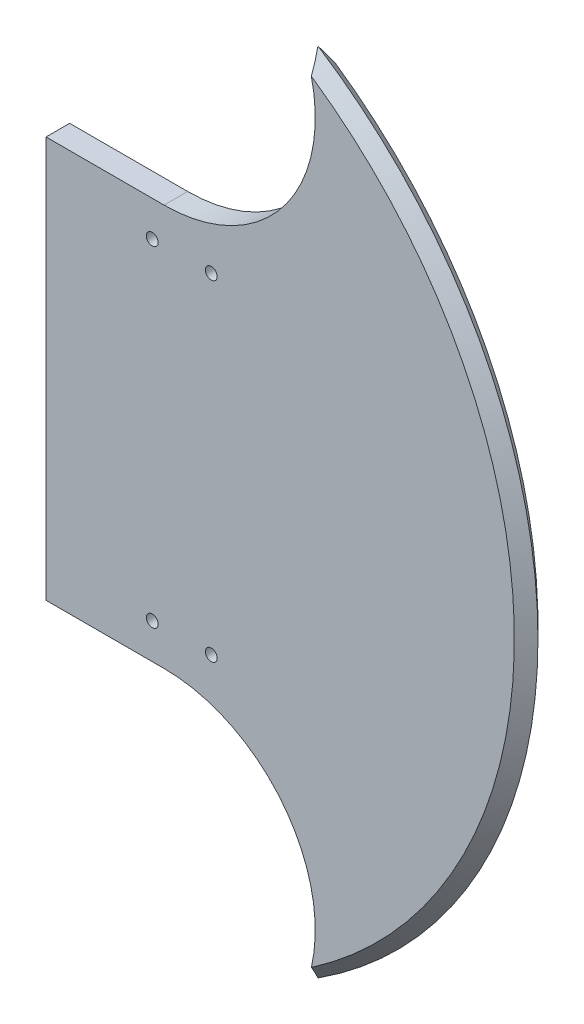
ISO-10303-21;
HEADER;
FILE_DESCRIPTION(('STEP AP214'),'2;1');
FILE_NAME('part.step','',(''),(''),'','','');
FILE_SCHEMA(('AUTOMOTIVE_DESIGN { 1 0 10303 214 1 1 1 1 }'));
ENDSEC;
DATA;
#1=APPLICATION_CONTEXT('core data for automotive mechanical design processes');
#2=APPLICATION_PROTOCOL_DEFINITION('international standard','automotive_design',2000,#1);
#3=PRODUCT_CONTEXT('',#1,'mechanical');
#4=PRODUCT('Part','Part','',(#3));
#5=PRODUCT_RELATED_PRODUCT_CATEGORY('part','',(#4));
#6=PRODUCT_DEFINITION_FORMATION('','',#4);
#7=PRODUCT_DEFINITION_CONTEXT('part definition',#1,'design');
#8=PRODUCT_DEFINITION('design','',#6,#7);
#9=PRODUCT_DEFINITION_SHAPE('','',#8);
#10=(LENGTH_UNIT() NAMED_UNIT(*) SI_UNIT(.MILLI.,.METRE.));
#11=(NAMED_UNIT(*) PLANE_ANGLE_UNIT() SI_UNIT($,.RADIAN.));
#12=(NAMED_UNIT(*) SI_UNIT($,.STERADIAN.) SOLID_ANGLE_UNIT());
#13=UNCERTAINTY_MEASURE_WITH_UNIT(LENGTH_MEASURE(1.E-05),#10,'distance_accuracy_value','');
#14=(GEOMETRIC_REPRESENTATION_CONTEXT(3) GLOBAL_UNCERTAINTY_ASSIGNED_CONTEXT((#13)) GLOBAL_UNIT_ASSIGNED_CONTEXT((#10,
#11,#12)) REPRESENTATION_CONTEXT('',''));
#15=CARTESIAN_POINT('',(0.,0.,0.));
#16=DIRECTION('',(0.,0.,1.));
#17=DIRECTION('',(1.,0.,0.));
#18=AXIS2_PLACEMENT_3D('',#15,#16,#17);
#19=CARTESIAN_POINT('',(0.,85.,10.));
#20=DIRECTION('',(0.,-1.,0.));
#21=DIRECTION('',(1.,0.,0.));
#22=AXIS2_PLACEMENT_3D('',#19,#20,#21);
#23=PLANE('',#22);
#24=DIRECTION('',(-1.,0.,0.));
#25=VECTOR('',#24,1.);
#26=CARTESIAN_POINT('',(0.,85.,0.));
#27=LINE('',#26,#25);
#28=CARTESIAN_POINT('',(50.,85.,0.));
#29=VERTEX_POINT('',#28);
#30=CARTESIAN_POINT('',(0.,85.,0.));
#31=VERTEX_POINT('',#30);
#32=EDGE_CURVE('E126',#29,#31,#27,.T.);
#33=ORIENTED_EDGE('',*,*,#32,.T.);
#34=DIRECTION('',(0.,0.,-1.));
#35=VECTOR('',#34,1.);
#36=CARTESIAN_POINT('',(0.,85.,10.));
#37=LINE('',#36,#35);
#38=CARTESIAN_POINT('',(0.,85.,10.));
#39=VERTEX_POINT('',#38);
#40=EDGE_CURVE('E105',#39,#31,#37,.T.);
#41=ORIENTED_EDGE('',*,*,#40,.F.);
#42=DIRECTION('',(-1.,0.,0.));
#43=VECTOR('',#42,1.);
#44=CARTESIAN_POINT('',(0.,85.,10.));
#45=LINE('',#44,#43);
#46=CARTESIAN_POINT('',(50.,85.,10.));
#47=VERTEX_POINT('',#46);
#48=EDGE_CURVE('E113',#47,#39,#45,.T.);
#49=ORIENTED_EDGE('',*,*,#48,.F.);
#50=DIRECTION('',(0.,0.,-1.));
#51=VECTOR('',#50,1.);
#52=CARTESIAN_POINT('',(50.,85.,10.));
#53=LINE('',#52,#51);
#54=EDGE_CURVE('E206',#47,#29,#53,.T.);
#55=ORIENTED_EDGE('',*,*,#54,.T.);
#56=EDGE_LOOP('',(#33,#41,#49,#55));
#57=FACE_BOUND('',#56,.T.);
#58=ADVANCED_FACE('F40',(#57),#23,.F.);
#59=CARTESIAN_POINT('',(0.,-85.,10.));
#60=DIRECTION('',(1.,0.,0.));
#61=DIRECTION('',(0.,0.,-1.));
#62=AXIS2_PLACEMENT_3D('',#59,#60,#61);
#63=PLANE('',#62);
#64=DIRECTION('',(0.,-1.,0.));
#65=VECTOR('',#64,1.);
#66=CARTESIAN_POINT('',(0.,-85.,0.));
#67=LINE('',#66,#65);
#68=CARTESIAN_POINT('',(0.,-85.,0.));
#69=VERTEX_POINT('',#68);
#70=EDGE_CURVE('E202',#31,#69,#67,.T.);
#71=ORIENTED_EDGE('',*,*,#70,.T.);
#72=DIRECTION('',(0.,0.,-1.));
#73=VECTOR('',#72,1.);
#74=CARTESIAN_POINT('',(0.,-85.,10.));
#75=LINE('',#74,#73);
#76=CARTESIAN_POINT('',(0.,-85.,10.));
#77=VERTEX_POINT('',#76);
#78=EDGE_CURVE('E108',#77,#69,#75,.T.);
#79=ORIENTED_EDGE('',*,*,#78,.F.);
#80=DIRECTION('',(0.,-1.,0.));
#81=VECTOR('',#80,1.);
#82=CARTESIAN_POINT('',(0.,-85.,10.));
#83=LINE('',#82,#81);
#84=EDGE_CURVE('E101',#39,#77,#83,.T.);
#85=ORIENTED_EDGE('',*,*,#84,.F.);
#86=ORIENTED_EDGE('',*,*,#40,.T.);
#87=EDGE_LOOP('',(#71,#79,#85,#86));
#88=FACE_BOUND('',#87,.T.);
#89=ADVANCED_FACE('F103',(#88),#63,.F.);
#90=CARTESIAN_POINT('',(0.,-85.,10.));
#91=DIRECTION('',(0.,1.,0.));
#92=DIRECTION('',(-1.,0.,0.));
#93=AXIS2_PLACEMENT_3D('',#90,#91,#92);
#94=PLANE('',#93);
#95=DIRECTION('',(1.,0.,0.));
#96=VECTOR('',#95,1.);
#97=CARTESIAN_POINT('',(0.,-85.,0.));
#98=LINE('',#97,#96);
#99=CARTESIAN_POINT('',(50.,-85.,0.));
#100=VERTEX_POINT('',#99);
#101=EDGE_CURVE('E196',#69,#100,#98,.T.);
#102=ORIENTED_EDGE('',*,*,#101,.T.);
#103=DIRECTION('',(0.,0.,-1.));
#104=VECTOR('',#103,1.);
#105=CARTESIAN_POINT('',(50.,-85.,10.));
#106=LINE('',#105,#104);
#107=CARTESIAN_POINT('',(50.,-85.,10.));
#108=VERTEX_POINT('',#107);
#109=EDGE_CURVE('E134',#108,#100,#106,.T.);
#110=ORIENTED_EDGE('',*,*,#109,.F.);
#111=DIRECTION('',(1.,0.,0.));
#112=VECTOR('',#111,1.);
#113=CARTESIAN_POINT('',(0.,-85.,10.));
#114=LINE('',#113,#112);
#115=EDGE_CURVE('E112',#77,#108,#114,.T.);
#116=ORIENTED_EDGE('',*,*,#115,.F.);
#117=ORIENTED_EDGE('',*,*,#78,.T.);
#118=EDGE_LOOP('',(#102,#110,#116,#117));
#119=FACE_BOUND('',#118,.T.);
#120=ADVANCED_FACE('F161',(#119),#94,.F.);
#121=CARTESIAN_POINT('',(50.,-149.050097962701,10.));
#122=DIRECTION('',(0.,0.,-1.));
#123=DIRECTION('',(-1.,0.,0.));
#124=AXIS2_PLACEMENT_3D('',#121,#122,#123);
#125=CYLINDRICAL_SURFACE('',#124,64.0500979627015);
#126=CARTESIAN_POINT('',(50.,-149.050097962701,0.));
#127=DIRECTION('',(0.,0.,-1.));
#128=DIRECTION('',(-1.,0.,0.));
#129=AXIS2_PLACEMENT_3D('',#126,#127,#128);
#130=CIRCLE('',#129,64.0500979627015);
#131=CARTESIAN_POINT('',(112.40494183221,-163.473630260655,0.));
#132=VERTEX_POINT('',#131);
#133=EDGE_CURVE('E201',#100,#132,#130,.T.);
#134=ORIENTED_EDGE('',*,*,#133,.T.);
#135=CARTESIAN_POINT('',(112.40494183221,-163.473630260655,0.));
#136=CARTESIAN_POINT('',(112.260655109037,-164.097903249313,0.432652560486265));
#137=CARTESIAN_POINT('',(112.106433412453,-164.722463634494,0.861599540904019));
#138=CARTESIAN_POINT('',(111.77792946843,-165.971057221178,1.7113628165028));
#139=CARTESIAN_POINT('',(111.603663677746,-166.595090437366,2.13218545509228));
#140=CARTESIAN_POINT('',(111.234644952848,-167.842553512104,2.96569117694758));
#141=CARTESIAN_POINT('',(111.039891821556,-168.46598336479,3.37837418186882));
#142=CARTESIAN_POINT('',(110.629427093998,-169.712099619222,4.19553433276713));
#143=CARTESIAN_POINT('',(110.413698526988,-170.334784999341,4.60000450870104));
#144=CARTESIAN_POINT('',(110.187404416165,-170.956521647927,4.99999999999998));
#145=B_SPLINE_CURVE_WITH_KNOTS('',3,(#135,#136,#137,#138,#139,#140,#141,#142,#143,#144),
.UNSPECIFIED.,.F.,.F.,(4,2,2,2,4),(0.,2.31932301338159,4.63675521133106,6.95420970385943,
9.27355504997685),.UNSPECIFIED.);
#146=CARTESIAN_POINT('',(110.187404416165,-170.956521647927,4.99999999999994));
#147=VERTEX_POINT('',#146);
#148=EDGE_CURVE('E52',#132,#147,#145,.T.);
#149=ORIENTED_EDGE('',*,*,#148,.T.);
#150=CARTESIAN_POINT('',(110.187404416165,-170.956521647927,4.99999999999994));
#151=CARTESIAN_POINT('',(110.413698526988,-170.334784999341,5.39999549129889));
#152=CARTESIAN_POINT('',(110.629427093998,-169.712099619222,5.80446566723281));
#153=CARTESIAN_POINT('',(111.039891821556,-168.46598336479,6.62162581813113));
#154=CARTESIAN_POINT('',(111.234644952848,-167.842553512104,7.03430882305238));
#155=CARTESIAN_POINT('',(111.603663677746,-166.595090437366,7.86781454490769));
#156=CARTESIAN_POINT('',(111.77792946843,-165.971057221178,8.28863718349718));
#157=CARTESIAN_POINT('',(112.106433412453,-164.722463634494,9.13840045909597));
#158=CARTESIAN_POINT('',(112.260655109037,-164.097903249313,9.56734743951373));
#159=CARTESIAN_POINT('',(112.40494183221,-163.473630260655,10.));
#160=B_SPLINE_CURVE_WITH_KNOTS('',3,(#150,#151,#152,#153,#154,#155,#156,#157,#158,#159),
.UNSPECIFIED.,.F.,.F.,(4,2,2,2,4),(0.,2.31934534611745,4.63679983864583,6.95423203659534,
9.27355504997697),.UNSPECIFIED.);
#161=CARTESIAN_POINT('',(112.40494183221,-163.473630260655,10.));
#162=VERTEX_POINT('',#161);
#163=EDGE_CURVE('E60',#147,#162,#160,.T.);
#164=ORIENTED_EDGE('',*,*,#163,.T.);
#165=CARTESIAN_POINT('',(50.,-149.050097962701,10.));
#166=DIRECTION('',(0.,0.,-1.));
#167=DIRECTION('',(-1.,0.,0.));
#168=AXIS2_PLACEMENT_3D('',#165,#166,#167);
#169=CIRCLE('',#168,64.0500979627015);
#170=EDGE_CURVE('E204',#108,#162,#169,.T.);
#171=ORIENTED_EDGE('',*,*,#170,.F.);
#172=ORIENTED_EDGE('',*,*,#109,.T.);
#173=EDGE_LOOP('',(#134,#149,#164,#171,#172));
#174=FACE_BOUND('',#173,.T.);
#175=ADVANCED_FACE('F153',(#174),#125,.F.);
#176=CARTESIAN_POINT('',(50.,149.050097962701,10.));
#177=DIRECTION('',(0.,0.,-1.));
#178=DIRECTION('',(-1.,0.,0.));
#179=AXIS2_PLACEMENT_3D('',#176,#177,#178);
#180=CYLINDRICAL_SURFACE('',#179,64.0500979627015);
#181=CARTESIAN_POINT('',(112.40494183221,163.473630260655,10.));
#182=CARTESIAN_POINT('',(112.260655109037,164.097903249313,9.56734743951373));
#183=CARTESIAN_POINT('',(112.106433412453,164.722463634494,9.13840045909597));
#184=CARTESIAN_POINT('',(111.77792946843,165.971057221178,8.28863718349717));
#185=CARTESIAN_POINT('',(111.603663677746,166.595090437366,7.86781454490767));
#186=CARTESIAN_POINT('',(111.234644952848,167.842553512104,7.03430882305237));
#187=CARTESIAN_POINT('',(111.039891821556,168.46598336479,6.62162581813112));
#188=CARTESIAN_POINT('',(110.629427093998,169.712099619222,5.80446566723281));
#189=CARTESIAN_POINT('',(110.413698526988,170.334784999341,5.39999549129889));
#190=CARTESIAN_POINT('',(110.187404416165,170.956521647927,4.99999999999991));
#191=B_SPLINE_CURVE_WITH_KNOTS('',3,(#181,#182,#183,#184,#185,#186,#187,#188,#189,#190),
.UNSPECIFIED.,.F.,.F.,(4,2,2,2,4),(0.,2.31932301338163,4.63675521133113,6.95420970385953,
9.27355504997698),.UNSPECIFIED.);
#192=CARTESIAN_POINT('',(112.40494183221,163.473630260655,10.));
#193=VERTEX_POINT('',#192);
#194=CARTESIAN_POINT('',(110.187404416165,170.956521647927,4.99999999999994));
#195=VERTEX_POINT('',#194);
#196=EDGE_CURVE('E128',#193,#195,#191,.T.);
#197=ORIENTED_EDGE('',*,*,#196,.T.);
#198=CARTESIAN_POINT('',(110.187404416165,170.956521647927,5.));
#199=CARTESIAN_POINT('',(110.413698526988,170.334784999341,4.60000450870108));
#200=CARTESIAN_POINT('',(110.629427093998,169.712099619222,4.19553433276717));
#201=CARTESIAN_POINT('',(111.039891821556,168.46598336479,3.37837418186887));
#202=CARTESIAN_POINT('',(111.234644952848,167.842553512104,2.96569117694761));
#203=CARTESIAN_POINT('',(111.603663677746,166.595090437366,2.1321854550923));
#204=CARTESIAN_POINT('',(111.77792946843,165.971057221178,1.71136281650281));
#205=CARTESIAN_POINT('',(112.106433412453,164.722463634494,0.86159954090403));
#206=CARTESIAN_POINT('',(112.260655109037,164.097903249313,0.432652560486276));
#207=CARTESIAN_POINT('',(112.40494183221,163.473630260656,0.));
#208=B_SPLINE_CURVE_WITH_KNOTS('',3,(#198,#199,#200,#201,#202,#203,#204,#205,#206,#207),
.UNSPECIFIED.,.F.,.F.,(4,2,2,2,4),(0.,2.31934534611743,4.63679983864581,6.95423203659531,
9.2735550499769),.UNSPECIFIED.);
#209=CARTESIAN_POINT('',(112.40494183221,163.473630260655,0.));
#210=VERTEX_POINT('',#209);
#211=EDGE_CURVE('E132',#195,#210,#208,.T.);
#212=ORIENTED_EDGE('',*,*,#211,.T.);
#213=CARTESIAN_POINT('',(50.,149.050097962701,0.));
#214=DIRECTION('',(0.,0.,-1.));
#215=DIRECTION('',(1.,0.,0.));
#216=AXIS2_PLACEMENT_3D('',#213,#214,#215);
#217=CIRCLE('',#216,64.0500979627015);
#218=EDGE_CURVE('E123',#210,#29,#217,.T.);
#219=ORIENTED_EDGE('',*,*,#218,.T.);
#220=ORIENTED_EDGE('',*,*,#54,.F.);
#221=CARTESIAN_POINT('',(50.,149.050097962701,10.));
#222=DIRECTION('',(0.,0.,-1.));
#223=DIRECTION('',(1.,0.,0.));
#224=AXIS2_PLACEMENT_3D('',#221,#222,#223);
#225=CIRCLE('',#224,64.0500979627015);
#226=EDGE_CURVE('E118',#193,#47,#225,.T.);
#227=ORIENTED_EDGE('',*,*,#226,.F.);
#228=EDGE_LOOP('',(#197,#212,#219,#220,#227));
#229=FACE_BOUND('',#228,.T.);
#230=ADVANCED_FACE('F148',(#229),#180,.F.);
#231=CARTESIAN_POINT('',(50.,149.050097962701,10.));
#232=DIRECTION('',(0.,0.,1.));
#233=DIRECTION('',(1.,0.,0.));
#234=AXIS2_PLACEMENT_3D('',#231,#232,#233);
#235=PLANE('',#234);
#236=CARTESIAN_POINT('',(45.,70.,10.));
#237=DIRECTION('',(0.,0.,1.));
#238=DIRECTION('',(-1.,0.,0.));
#239=AXIS2_PLACEMENT_3D('',#236,#237,#238);
#240=CIRCLE('',#239,2.5);
#241=CARTESIAN_POINT('',(42.5,70.,10.));
#242=VERTEX_POINT('',#241);
#243=EDGE_CURVE('E283',#242,#242,#240,.T.);
#244=ORIENTED_EDGE('',*,*,#243,.F.);
#245=EDGE_LOOP('',(#244));
#246=FACE_BOUND('',#245,.T.);
#247=CARTESIAN_POINT('',(70.,70.,10.));
#248=DIRECTION('',(0.,0.,1.));
#249=DIRECTION('',(-1.,0.,0.));
#250=AXIS2_PLACEMENT_3D('',#247,#248,#249);
#251=CIRCLE('',#250,2.5);
#252=CARTESIAN_POINT('',(67.5,70.,10.));
#253=VERTEX_POINT('',#252);
#254=EDGE_CURVE('E286',#253,#253,#251,.T.);
#255=ORIENTED_EDGE('',*,*,#254,.F.);
#256=EDGE_LOOP('',(#255));
#257=FACE_BOUND('',#256,.T.);
#258=CARTESIAN_POINT('',(70.,-70.,10.));
#259=DIRECTION('',(0.,0.,1.));
#260=DIRECTION('',(1.,0.,0.));
#261=AXIS2_PLACEMENT_3D('',#258,#259,#260);
#262=CIRCLE('',#261,2.5);
#263=CARTESIAN_POINT('',(72.5,-70.,10.));
#264=VERTEX_POINT('',#263);
#265=EDGE_CURVE('E290',#264,#264,#262,.T.);
#266=ORIENTED_EDGE('',*,*,#265,.F.);
#267=EDGE_LOOP('',(#266));
#268=FACE_BOUND('',#267,.T.);
#269=CARTESIAN_POINT('',(45.,-70.,10.));
#270=DIRECTION('',(0.,0.,1.));
#271=DIRECTION('',(1.,0.,0.));
#272=AXIS2_PLACEMENT_3D('',#269,#270,#271);
#273=CIRCLE('',#272,2.5);
#274=CARTESIAN_POINT('',(47.5,-70.,10.));
#275=VERTEX_POINT('',#274);
#276=EDGE_CURVE('E246',#275,#275,#273,.T.);
#277=ORIENTED_EDGE('',*,*,#276,.F.);
#278=EDGE_LOOP('',(#277));
#279=FACE_BOUND('',#278,.T.);
#280=ORIENTED_EDGE('',*,*,#170,.T.);
#281=CARTESIAN_POINT('',(0.,0.,10.));
#282=DIRECTION('',(0.,0.,1.));
#283=DIRECTION('',(1.,0.,0.));
#284=AXIS2_PLACEMENT_3D('',#281,#282,#283);
#285=CIRCLE('',#284,198.389764702971);
#286=EDGE_CURVE('E11',#162,#193,#285,.T.);
#287=ORIENTED_EDGE('',*,*,#286,.T.);
#288=ORIENTED_EDGE('',*,*,#226,.T.);
#289=ORIENTED_EDGE('',*,*,#48,.T.);
#290=ORIENTED_EDGE('',*,*,#84,.T.);
#291=ORIENTED_EDGE('',*,*,#115,.T.);
#292=EDGE_LOOP('',(#280,#287,#288,#289,#290,#291));
#293=FACE_BOUND('',#292,.T.);
#294=ADVANCED_FACE('F116',(#246,#257,#268,#279,#293),#235,.T.);
#295=CARTESIAN_POINT('',(50.,149.050097962701,0.));
#296=DIRECTION('',(0.,0.,1.));
#297=DIRECTION('',(1.,0.,0.));
#298=AXIS2_PLACEMENT_3D('',#295,#296,#297);
#299=PLANE('',#298);
#300=CARTESIAN_POINT('',(45.,70.,0.));
#301=DIRECTION('',(0.,0.,1.));
#302=DIRECTION('',(1.,0.,0.));
#303=AXIS2_PLACEMENT_3D('',#300,#301,#302);
#304=CIRCLE('',#303,2.5);
#305=CARTESIAN_POINT('',(47.5,70.,0.));
#306=VERTEX_POINT('',#305);
#307=EDGE_CURVE('E46',#306,#306,#304,.T.);
#308=ORIENTED_EDGE('',*,*,#307,.T.);
#309=EDGE_LOOP('',(#308));
#310=FACE_BOUND('',#309,.T.);
#311=CARTESIAN_POINT('',(70.,70.,0.));
#312=DIRECTION('',(0.,0.,1.));
#313=DIRECTION('',(1.,0.,0.));
#314=AXIS2_PLACEMENT_3D('',#311,#312,#313);
#315=CIRCLE('',#314,2.5);
#316=CARTESIAN_POINT('',(72.5,70.,0.));
#317=VERTEX_POINT('',#316);
#318=EDGE_CURVE('E239',#317,#317,#315,.T.);
#319=ORIENTED_EDGE('',*,*,#318,.T.);
#320=EDGE_LOOP('',(#319));
#321=FACE_BOUND('',#320,.T.);
#322=CARTESIAN_POINT('',(70.,-70.,0.));
#323=DIRECTION('',(0.,0.,1.));
#324=DIRECTION('',(1.,0.,0.));
#325=AXIS2_PLACEMENT_3D('',#322,#323,#324);
#326=CIRCLE('',#325,2.5);
#327=CARTESIAN_POINT('',(72.5,-70.,0.));
#328=VERTEX_POINT('',#327);
#329=EDGE_CURVE('E245',#328,#328,#326,.T.);
#330=ORIENTED_EDGE('',*,*,#329,.T.);
#331=EDGE_LOOP('',(#330));
#332=FACE_BOUND('',#331,.T.);
#333=CARTESIAN_POINT('',(45.,-70.,0.));
#334=DIRECTION('',(0.,0.,1.));
#335=DIRECTION('',(1.,0.,0.));
#336=AXIS2_PLACEMENT_3D('',#333,#334,#335);
#337=CIRCLE('',#336,2.5);
#338=CARTESIAN_POINT('',(47.5,-70.,0.));
#339=VERTEX_POINT('',#338);
#340=EDGE_CURVE('E241',#339,#339,#337,.T.);
#341=ORIENTED_EDGE('',*,*,#340,.T.);
#342=EDGE_LOOP('',(#341));
#343=FACE_BOUND('',#342,.T.);
#344=ORIENTED_EDGE('',*,*,#218,.F.);
#345=CARTESIAN_POINT('',(0.,0.,0.));
#346=DIRECTION('',(0.,0.,1.));
#347=DIRECTION('',(1.,0.,0.));
#348=AXIS2_PLACEMENT_3D('',#345,#346,#347);
#349=CIRCLE('',#348,198.389764702971);
#350=EDGE_CURVE('E210',#210,#132,#349,.F.);
#351=ORIENTED_EDGE('',*,*,#350,.T.);
#352=ORIENTED_EDGE('',*,*,#133,.F.);
#353=ORIENTED_EDGE('',*,*,#101,.F.);
#354=ORIENTED_EDGE('',*,*,#70,.F.);
#355=ORIENTED_EDGE('',*,*,#32,.F.);
#356=EDGE_LOOP('',(#344,#351,#352,#353,#354,#355));
#357=FACE_BOUND('',#356,.T.);
#358=ADVANCED_FACE('F155',(#310,#321,#332,#343,#357),#299,.F.);
#359=CARTESIAN_POINT('',(0.,0.,10.));
#360=DIRECTION('',(0.,0.,-1.));
#361=DIRECTION('',(-1.,0.,0.));
#362=AXIS2_PLACEMENT_3D('',#359,#360,#361);
#363=CONICAL_SURFACE('',#362,198.389764702971,0.785398163397446);
#364=ORIENTED_EDGE('',*,*,#286,.F.);
#365=ORIENTED_EDGE('',*,*,#163,.F.);
#366=CARTESIAN_POINT('',(0.,0.,4.99999999999994));
#367=DIRECTION('',(0.,0.,1.));
#368=DIRECTION('',(1.,0.,0.));
#369=AXIS2_PLACEMENT_3D('',#366,#367,#368);
#370=CIRCLE('',#369,203.389764702971);
#371=EDGE_CURVE('E225',#195,#147,#370,.F.);
#372=ORIENTED_EDGE('',*,*,#371,.F.);
#373=ORIENTED_EDGE('',*,*,#196,.F.);
#374=EDGE_LOOP('',(#364,#365,#372,#373));
#375=FACE_BOUND('',#374,.T.);
#376=ADVANCED_FACE('F43',(#375),#363,.T.);
#377=CARTESIAN_POINT('',(0.,0.,5.));
#378=DIRECTION('',(0.,0.,1.));
#379=DIRECTION('',(1.,0.,0.));
#380=AXIS2_PLACEMENT_3D('',#377,#378,#379);
#381=CONICAL_SURFACE('',#380,203.389764702971,0.785398163397448);
#382=ORIENTED_EDGE('',*,*,#148,.F.);
#383=ORIENTED_EDGE('',*,*,#350,.F.);
#384=ORIENTED_EDGE('',*,*,#211,.F.);
#385=ORIENTED_EDGE('',*,*,#371,.T.);
#386=EDGE_LOOP('',(#382,#383,#384,#385));
#387=FACE_BOUND('',#386,.T.);
#388=ADVANCED_FACE('F177',(#387),#381,.T.);
#389=CARTESIAN_POINT('',(45.,-70.,-20.));
#390=DIRECTION('',(0.,0.,1.));
#391=DIRECTION('',(1.,0.,0.));
#392=AXIS2_PLACEMENT_3D('',#389,#390,#391);
#393=CYLINDRICAL_SURFACE('',#392,2.5);
#394=ORIENTED_EDGE('',*,*,#276,.T.);
#395=EDGE_LOOP('',(#394));
#396=FACE_BOUND('',#395,.T.);
#397=ORIENTED_EDGE('',*,*,#340,.F.);
#398=EDGE_LOOP('',(#397));
#399=FACE_BOUND('',#398,.T.);
#400=ADVANCED_FACE('F183',(#396,#399),#393,.F.);
#401=CARTESIAN_POINT('',(70.,-70.,-20.));
#402=DIRECTION('',(0.,0.,1.));
#403=DIRECTION('',(1.,0.,0.));
#404=AXIS2_PLACEMENT_3D('',#401,#402,#403);
#405=CYLINDRICAL_SURFACE('',#404,2.5);
#406=ORIENTED_EDGE('',*,*,#265,.T.);
#407=EDGE_LOOP('',(#406));
#408=FACE_BOUND('',#407,.T.);
#409=ORIENTED_EDGE('',*,*,#329,.F.);
#410=EDGE_LOOP('',(#409));
#411=FACE_BOUND('',#410,.T.);
#412=ADVANCED_FACE('F258',(#408,#411),#405,.F.);
#413=CARTESIAN_POINT('',(70.,70.,-20.));
#414=DIRECTION('',(0.,0.,1.));
#415=DIRECTION('',(1.,0.,0.));
#416=AXIS2_PLACEMENT_3D('',#413,#414,#415);
#417=CYLINDRICAL_SURFACE('',#416,2.5);
#418=ORIENTED_EDGE('',*,*,#254,.T.);
#419=EDGE_LOOP('',(#418));
#420=FACE_BOUND('',#419,.T.);
#421=ORIENTED_EDGE('',*,*,#318,.F.);
#422=EDGE_LOOP('',(#421));
#423=FACE_BOUND('',#422,.T.);
#424=ADVANCED_FACE('F255',(#420,#423),#417,.F.);
#425=CARTESIAN_POINT('',(45.,70.,-20.));
#426=DIRECTION('',(0.,0.,1.));
#427=DIRECTION('',(1.,0.,0.));
#428=AXIS2_PLACEMENT_3D('',#425,#426,#427);
#429=CYLINDRICAL_SURFACE('',#428,2.5);
#430=ORIENTED_EDGE('',*,*,#243,.T.);
#431=EDGE_LOOP('',(#430));
#432=FACE_BOUND('',#431,.T.);
#433=ORIENTED_EDGE('',*,*,#307,.F.);
#434=EDGE_LOOP('',(#433));
#435=FACE_BOUND('',#434,.T.);
#436=ADVANCED_FACE('F257',(#432,#435),#429,.F.);
#437=CLOSED_SHELL('',(#58,#89,#120,#175,#230,#294,#358,#376,#388,#400,#412,#424,#436));
#438=MANIFOLD_SOLID_BREP('B2',#437);
#439=ADVANCED_BREP_SHAPE_REPRESENTATION('',(#18,#438),#14);
#440=SHAPE_DEFINITION_REPRESENTATION(#9,#439);
ENDSEC;
END-ISO-10303-21;
